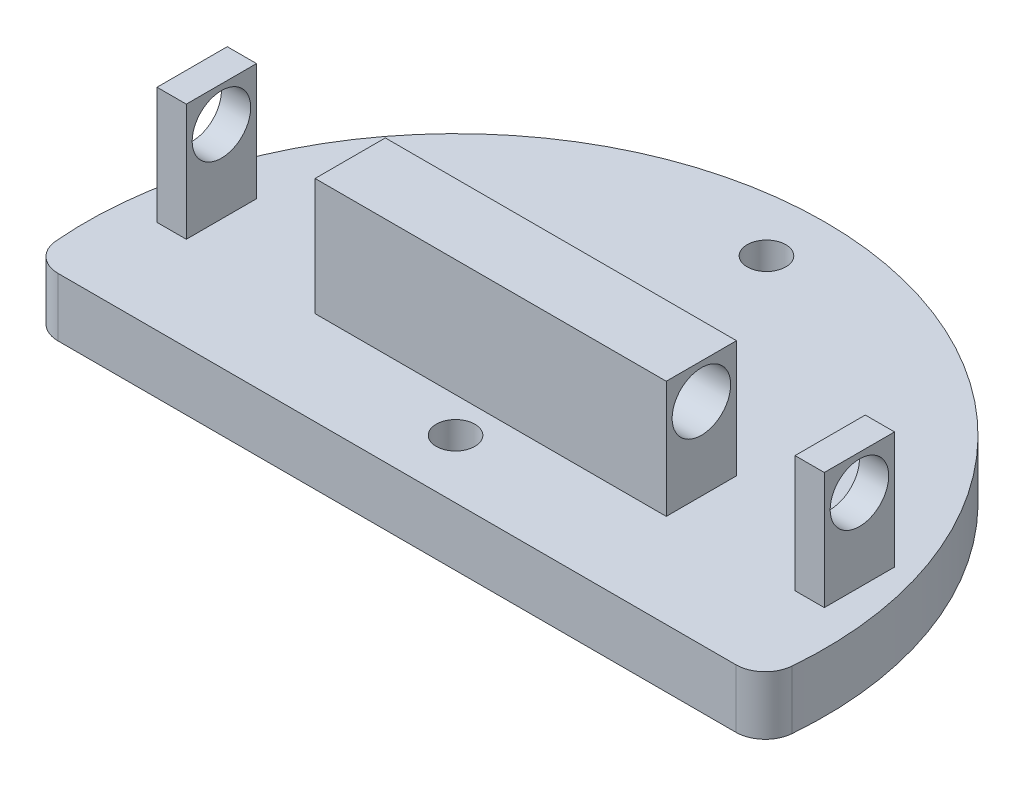
ISO-10303-21;
HEADER;
FILE_DESCRIPTION(('STEP AP214'),'2;1');
FILE_NAME('part.step','',(''),(''),'','','');
FILE_SCHEMA(('AUTOMOTIVE_DESIGN { 1 0 10303 214 1 1 1 1 }'));
ENDSEC;
DATA;
#1=APPLICATION_CONTEXT('core data for automotive mechanical design processes');
#2=APPLICATION_PROTOCOL_DEFINITION('international standard','automotive_design',2000,#1);
#3=PRODUCT_CONTEXT('',#1,'mechanical');
#4=PRODUCT('Part','Part','',(#3));
#5=PRODUCT_RELATED_PRODUCT_CATEGORY('part','',(#4));
#6=PRODUCT_DEFINITION_FORMATION('','',#4);
#7=PRODUCT_DEFINITION_CONTEXT('part definition',#1,'design');
#8=PRODUCT_DEFINITION('design','',#6,#7);
#9=PRODUCT_DEFINITION_SHAPE('','',#8);
#10=(LENGTH_UNIT() NAMED_UNIT(*) SI_UNIT(.MILLI.,.METRE.));
#11=(NAMED_UNIT(*) PLANE_ANGLE_UNIT() SI_UNIT($,.RADIAN.));
#12=(NAMED_UNIT(*) SI_UNIT($,.STERADIAN.) SOLID_ANGLE_UNIT());
#13=UNCERTAINTY_MEASURE_WITH_UNIT(LENGTH_MEASURE(1.E-05),#10,'distance_accuracy_value','');
#14=(GEOMETRIC_REPRESENTATION_CONTEXT(3) GLOBAL_UNCERTAINTY_ASSIGNED_CONTEXT((#13)) GLOBAL_UNIT_ASSIGNED_CONTEXT((#10,
#11,#12)) REPRESENTATION_CONTEXT('',''));
#15=CARTESIAN_POINT('',(0.,0.,0.));
#16=DIRECTION('',(0.,0.,1.));
#17=DIRECTION('',(1.,0.,0.));
#18=AXIS2_PLACEMENT_3D('',#15,#16,#17);
#19=CARTESIAN_POINT('',(0.,5.,0.));
#20=DIRECTION('',(0.,-1.,0.));
#21=DIRECTION('',(0.,0.,-1.));
#22=AXIS2_PLACEMENT_3D('',#19,#20,#21);
#23=PLANE('',#22);
#24=DIRECTION('',(0.,0.,1.));
#25=VECTOR('',#24,1.);
#26=CARTESIAN_POINT('',(26.,5.,-3.));
#27=LINE('',#26,#25);
#28=CARTESIAN_POINT('',(26.,5.,-9.));
#29=VERTEX_POINT('',#28);
#30=CARTESIAN_POINT('',(26.,5.,-3.));
#31=VERTEX_POINT('',#30);
#32=EDGE_CURVE('E191',#29,#31,#27,.T.);
#33=ORIENTED_EDGE('',*,*,#32,.F.);
#34=DIRECTION('',(-1.,0.,0.));
#35=VECTOR('',#34,1.);
#36=CARTESIAN_POINT('',(26.,5.,-9.));
#37=LINE('',#36,#35);
#38=CARTESIAN_POINT('',(28.5,5.,-9.));
#39=VERTEX_POINT('',#38);
#40=EDGE_CURVE('E204',#39,#29,#37,.T.);
#41=ORIENTED_EDGE('',*,*,#40,.F.);
#42=DIRECTION('',(0.,0.,-1.));
#43=VECTOR('',#42,1.);
#44=CARTESIAN_POINT('',(28.5,5.,-3.));
#45=LINE('',#44,#43);
#46=CARTESIAN_POINT('',(28.5,5.,-3.));
#47=VERTEX_POINT('',#46);
#48=EDGE_CURVE('E213',#47,#39,#45,.T.);
#49=ORIENTED_EDGE('',*,*,#48,.F.);
#50=DIRECTION('',(1.,0.,0.));
#51=VECTOR('',#50,1.);
#52=CARTESIAN_POINT('',(26.,5.,-3.));
#53=LINE('',#52,#51);
#54=EDGE_CURVE('E194',#31,#47,#53,.T.);
#55=ORIENTED_EDGE('',*,*,#54,.F.);
#56=EDGE_LOOP('',(#33,#41,#49,#55));
#57=FACE_BOUND('',#56,.T.);
#58=CARTESIAN_POINT('',(0.,5.,-26.56));
#59=DIRECTION('',(0.,1.,0.));
#60=DIRECTION('',(0.,0.,1.));
#61=AXIS2_PLACEMENT_3D('',#58,#59,#60);
#62=CIRCLE('',#61,1.65);
#63=CARTESIAN_POINT('',(0.,5.,-24.91));
#64=VERTEX_POINT('',#63);
#65=EDGE_CURVE('E263',#64,#64,#62,.T.);
#66=ORIENTED_EDGE('',*,*,#65,.F.);
#67=EDGE_LOOP('',(#66));
#68=FACE_BOUND('',#67,.T.);
#69=CARTESIAN_POINT('',(0.,5.,0.));
#70=DIRECTION('',(0.,1.,0.));
#71=DIRECTION('',(0.,0.,1.));
#72=AXIS2_PLACEMENT_3D('',#69,#70,#71);
#73=CIRCLE('',#72,1.65);
#74=CARTESIAN_POINT('',(0.,5.,1.65));
#75=VERTEX_POINT('',#74);
#76=EDGE_CURVE('E269',#75,#75,#73,.T.);
#77=ORIENTED_EDGE('',*,*,#76,.F.);
#78=EDGE_LOOP('',(#77));
#79=FACE_BOUND('',#78,.T.);
#80=DIRECTION('',(-1.,0.,0.));
#81=VECTOR('',#80,1.);
#82=CARTESIAN_POINT('',(0.,5.,5.));
#83=LINE('',#82,#81);
#84=CARTESIAN_POINT('',(28.9522641601654,5.,5.));
#85=VERTEX_POINT('',#84);
#86=CARTESIAN_POINT('',(-28.9522641601654,5.,5.));
#87=VERTEX_POINT('',#86);
#88=EDGE_CURVE('E275',#85,#87,#83,.T.);
#89=ORIENTED_EDGE('',*,*,#88,.F.);
#90=CARTESIAN_POINT('',(28.9522641601654,5.,2.5));
#91=DIRECTION('',(0.,-1.,0.));
#92=DIRECTION('',(0.,0.,-1.));
#93=AXIS2_PLACEMENT_3D('',#90,#91,#92);
#94=CIRCLE('',#93,2.5);
#95=CARTESIAN_POINT('',(31.4429957637585,5.,2.7150722642808));
#96=VERTEX_POINT('',#95);
#97=EDGE_CURVE('E12',#85,#96,#94,.F.);
#98=ORIENTED_EDGE('',*,*,#97,.T.);
#99=CARTESIAN_POINT('',(0.,5.,0.));
#100=DIRECTION('',(0.,-1.,0.));
#101=DIRECTION('',(0.,0.,-1.));
#102=AXIS2_PLACEMENT_3D('',#99,#100,#101);
#103=CIRCLE('',#102,31.56);
#104=CARTESIAN_POINT('',(-31.4429957637585,5.,2.7150722642808));
#105=VERTEX_POINT('',#104);
#106=EDGE_CURVE('E278',#105,#96,#103,.T.);
#107=ORIENTED_EDGE('',*,*,#106,.F.);
#108=CARTESIAN_POINT('',(-28.9522641601654,5.,2.5));
#109=DIRECTION('',(0.,-1.,0.));
#110=DIRECTION('',(0.,0.,-1.));
#111=AXIS2_PLACEMENT_3D('',#108,#109,#110);
#112=CIRCLE('',#111,2.5);
#113=EDGE_CURVE('E66',#105,#87,#112,.F.);
#114=ORIENTED_EDGE('',*,*,#113,.T.);
#115=EDGE_LOOP('',(#89,#98,#107,#114));
#116=FACE_BOUND('',#115,.T.);
#117=DIRECTION('',(0.,0.,1.));
#118=VECTOR('',#117,1.);
#119=CARTESIAN_POINT('',(-28.5,5.,-3.));
#120=LINE('',#119,#118);
#121=CARTESIAN_POINT('',(-28.5,5.,-9.));
#122=VERTEX_POINT('',#121);
#123=CARTESIAN_POINT('',(-28.5,5.,-3.));
#124=VERTEX_POINT('',#123);
#125=EDGE_CURVE('E229',#122,#124,#120,.T.);
#126=ORIENTED_EDGE('',*,*,#125,.F.);
#127=DIRECTION('',(-1.,0.,0.));
#128=VECTOR('',#127,1.);
#129=CARTESIAN_POINT('',(-28.5,5.,-9.));
#130=LINE('',#129,#128);
#131=CARTESIAN_POINT('',(-26.,5.,-9.));
#132=VERTEX_POINT('',#131);
#133=EDGE_CURVE('E234',#132,#122,#130,.T.);
#134=ORIENTED_EDGE('',*,*,#133,.F.);
#135=DIRECTION('',(0.,0.,-1.));
#136=VECTOR('',#135,1.);
#137=CARTESIAN_POINT('',(-26.,5.,-3.));
#138=LINE('',#137,#136);
#139=CARTESIAN_POINT('',(-26.,5.,-3.));
#140=VERTEX_POINT('',#139);
#141=EDGE_CURVE('E246',#140,#132,#138,.T.);
#142=ORIENTED_EDGE('',*,*,#141,.F.);
#143=DIRECTION('',(1.,0.,0.));
#144=VECTOR('',#143,1.);
#145=CARTESIAN_POINT('',(-28.5,5.,-3.));
#146=LINE('',#145,#144);
#147=EDGE_CURVE('E243',#124,#140,#146,.T.);
#148=ORIENTED_EDGE('',*,*,#147,.F.);
#149=EDGE_LOOP('',(#126,#134,#142,#148));
#150=FACE_BOUND('',#149,.T.);
#151=DIRECTION('',(0.,0.,1.));
#152=VECTOR('',#151,1.);
#153=CARTESIAN_POINT('',(-15.,5.,-3.));
#154=LINE('',#153,#152);
#155=CARTESIAN_POINT('',(-15.,5.,-9.));
#156=VERTEX_POINT('',#155);
#157=CARTESIAN_POINT('',(-15.,5.,-3.));
#158=VERTEX_POINT('',#157);
#159=EDGE_CURVE('E190',#156,#158,#154,.T.);
#160=ORIENTED_EDGE('',*,*,#159,.F.);
#161=DIRECTION('',(-1.,0.,0.));
#162=VECTOR('',#161,1.);
#163=CARTESIAN_POINT('',(-15.,5.,-9.));
#164=LINE('',#163,#162);
#165=CARTESIAN_POINT('',(15.,5.,-9.));
#166=VERTEX_POINT('',#165);
#167=EDGE_CURVE('E187',#166,#156,#164,.T.);
#168=ORIENTED_EDGE('',*,*,#167,.F.);
#169=DIRECTION('',(0.,0.,-1.));
#170=VECTOR('',#169,1.);
#171=CARTESIAN_POINT('',(15.,5.,-3.));
#172=LINE('',#171,#170);
#173=CARTESIAN_POINT('',(15.,5.,-3.));
#174=VERTEX_POINT('',#173);
#175=EDGE_CURVE('E78',#174,#166,#172,.T.);
#176=ORIENTED_EDGE('',*,*,#175,.F.);
#177=DIRECTION('',(1.,0.,0.));
#178=VECTOR('',#177,1.);
#179=CARTESIAN_POINT('',(-15.,5.,-3.));
#180=LINE('',#179,#178);
#181=EDGE_CURVE('E73',#158,#174,#180,.T.);
#182=ORIENTED_EDGE('',*,*,#181,.F.);
#183=EDGE_LOOP('',(#160,#168,#176,#182));
#184=FACE_BOUND('',#183,.T.);
#185=ADVANCED_FACE('F57',(#57,#68,#79,#116,#150,#184),#23,.F.);
#186=CARTESIAN_POINT('',(0.,0.,0.));
#187=DIRECTION('',(0.,-1.,0.));
#188=DIRECTION('',(0.,0.,-1.));
#189=AXIS2_PLACEMENT_3D('',#186,#187,#188);
#190=PLANE('',#189);
#191=CARTESIAN_POINT('',(0.,0.,0.));
#192=DIRECTION('',(0.,1.,0.));
#193=DIRECTION('',(0.,0.,1.));
#194=AXIS2_PLACEMENT_3D('',#191,#192,#193);
#195=CIRCLE('',#194,1.65);
#196=CARTESIAN_POINT('',(0.,0.,1.65));
#197=VERTEX_POINT('',#196);
#198=EDGE_CURVE('E266',#197,#197,#195,.T.);
#199=ORIENTED_EDGE('',*,*,#198,.T.);
#200=EDGE_LOOP('',(#199));
#201=FACE_BOUND('',#200,.T.);
#202=CARTESIAN_POINT('',(0.,0.,0.));
#203=DIRECTION('',(0.,-1.,0.));
#204=DIRECTION('',(0.,0.,-1.));
#205=AXIS2_PLACEMENT_3D('',#202,#203,#204);
#206=CIRCLE('',#205,31.56);
#207=CARTESIAN_POINT('',(-31.4429957637585,0.,2.7150722642808));
#208=VERTEX_POINT('',#207);
#209=CARTESIAN_POINT('',(31.4429957637585,0.,2.7150722642808));
#210=VERTEX_POINT('',#209);
#211=EDGE_CURVE('E272',#208,#210,#206,.T.);
#212=ORIENTED_EDGE('',*,*,#211,.T.);
#213=CARTESIAN_POINT('',(28.9522641601654,0.,2.5));
#214=DIRECTION('',(0.,-1.,0.));
#215=DIRECTION('',(0.,0.,-1.));
#216=AXIS2_PLACEMENT_3D('',#213,#214,#215);
#217=CIRCLE('',#216,2.5);
#218=CARTESIAN_POINT('',(28.9522641601654,0.,5.));
#219=VERTEX_POINT('',#218);
#220=EDGE_CURVE('E293',#210,#219,#217,.T.);
#221=ORIENTED_EDGE('',*,*,#220,.T.);
#222=DIRECTION('',(1.,0.,0.));
#223=VECTOR('',#222,1.);
#224=CARTESIAN_POINT('',(0.,0.,5.));
#225=LINE('',#224,#223);
#226=CARTESIAN_POINT('',(-28.9522641601654,0.,5.));
#227=VERTEX_POINT('',#226);
#228=EDGE_CURVE('E279',#227,#219,#225,.T.);
#229=ORIENTED_EDGE('',*,*,#228,.F.);
#230=CARTESIAN_POINT('',(-28.9522641601654,0.,2.5));
#231=DIRECTION('',(0.,-1.,0.));
#232=DIRECTION('',(0.,0.,-1.));
#233=AXIS2_PLACEMENT_3D('',#230,#231,#232);
#234=CIRCLE('',#233,2.5);
#235=EDGE_CURVE('E291',#227,#208,#234,.T.);
#236=ORIENTED_EDGE('',*,*,#235,.T.);
#237=EDGE_LOOP('',(#212,#221,#229,#236));
#238=FACE_BOUND('',#237,.T.);
#239=CARTESIAN_POINT('',(0.,0.,-26.56));
#240=DIRECTION('',(0.,1.,0.));
#241=DIRECTION('',(0.,0.,1.));
#242=AXIS2_PLACEMENT_3D('',#239,#240,#241);
#243=CIRCLE('',#242,1.65);
#244=CARTESIAN_POINT('',(0.,0.,-24.91));
#245=VERTEX_POINT('',#244);
#246=EDGE_CURVE('E262',#245,#245,#243,.T.);
#247=ORIENTED_EDGE('',*,*,#246,.T.);
#248=EDGE_LOOP('',(#247));
#249=FACE_BOUND('',#248,.T.);
#250=ADVANCED_FACE('F315',(#201,#238,#249),#190,.T.);
#251=CARTESIAN_POINT('',(0.,5.,5.));
#252=DIRECTION('',(0.,0.,-1.));
#253=DIRECTION('',(-1.,0.,0.));
#254=AXIS2_PLACEMENT_3D('',#251,#252,#253);
#255=PLANE('',#254);
#256=ORIENTED_EDGE('',*,*,#228,.T.);
#257=DIRECTION('',(0.,1.,0.));
#258=VECTOR('',#257,1.);
#259=CARTESIAN_POINT('',(28.9522641601654,5.,5.));
#260=LINE('',#259,#258);
#261=EDGE_CURVE('E298',#219,#85,#260,.T.);
#262=ORIENTED_EDGE('',*,*,#261,.T.);
#263=ORIENTED_EDGE('',*,*,#88,.T.);
#264=DIRECTION('',(0.,1.,0.));
#265=VECTOR('',#264,1.);
#266=CARTESIAN_POINT('',(-28.9522641601654,0.,5.));
#267=LINE('',#266,#265);
#268=EDGE_CURVE('E295',#87,#227,#267,.F.);
#269=ORIENTED_EDGE('',*,*,#268,.T.);
#270=EDGE_LOOP('',(#256,#262,#263,#269));
#271=FACE_BOUND('',#270,.T.);
#272=ADVANCED_FACE('F310',(#271),#255,.F.);
#273=CARTESIAN_POINT('',(0.,5.,0.));
#274=DIRECTION('',(0.,-1.,0.));
#275=DIRECTION('',(0.,0.,-1.));
#276=AXIS2_PLACEMENT_3D('',#273,#274,#275);
#277=CYLINDRICAL_SURFACE('',#276,31.56);
#278=ORIENTED_EDGE('',*,*,#106,.T.);
#279=DIRECTION('',(0.,-1.,0.));
#280=VECTOR('',#279,1.);
#281=CARTESIAN_POINT('',(31.4429957637585,5.,2.7150722642808));
#282=LINE('',#281,#280);
#283=EDGE_CURVE('E288',#96,#210,#282,.T.);
#284=ORIENTED_EDGE('',*,*,#283,.T.);
#285=ORIENTED_EDGE('',*,*,#211,.F.);
#286=DIRECTION('',(0.,-1.,0.));
#287=VECTOR('',#286,1.);
#288=CARTESIAN_POINT('',(-31.4429957637585,5.,2.7150722642808));
#289=LINE('',#288,#287);
#290=EDGE_CURVE('E282',#208,#105,#289,.F.);
#291=ORIENTED_EDGE('',*,*,#290,.T.);
#292=EDGE_LOOP('',(#278,#284,#285,#291));
#293=FACE_BOUND('',#292,.T.);
#294=ADVANCED_FACE('F318',(#293),#277,.T.);
#295=CARTESIAN_POINT('',(0.,5.,0.));
#296=DIRECTION('',(0.,-1.,0.));
#297=DIRECTION('',(0.,0.,-1.));
#298=AXIS2_PLACEMENT_3D('',#295,#296,#297);
#299=CYLINDRICAL_SURFACE('',#298,1.65);
#300=ORIENTED_EDGE('',*,*,#76,.T.);
#301=EDGE_LOOP('',(#300));
#302=FACE_BOUND('',#301,.T.);
#303=ORIENTED_EDGE('',*,*,#198,.F.);
#304=EDGE_LOOP('',(#303));
#305=FACE_BOUND('',#304,.T.);
#306=ADVANCED_FACE('F329',(#302,#305),#299,.F.);
#307=CARTESIAN_POINT('',(0.,5.,-26.56));
#308=DIRECTION('',(0.,-1.,0.));
#309=DIRECTION('',(0.,0.,-1.));
#310=AXIS2_PLACEMENT_3D('',#307,#308,#309);
#311=CYLINDRICAL_SURFACE('',#310,1.65);
#312=ORIENTED_EDGE('',*,*,#65,.T.);
#313=EDGE_LOOP('',(#312));
#314=FACE_BOUND('',#313,.T.);
#315=ORIENTED_EDGE('',*,*,#246,.F.);
#316=EDGE_LOOP('',(#315));
#317=FACE_BOUND('',#316,.T.);
#318=ADVANCED_FACE('F323',(#314,#317),#311,.F.);
#319=CARTESIAN_POINT('',(28.9522641601654,5.,2.5));
#320=DIRECTION('',(0.,-1.,0.));
#321=DIRECTION('',(0.,0.,-1.));
#322=AXIS2_PLACEMENT_3D('',#319,#320,#321);
#323=CYLINDRICAL_SURFACE('',#322,2.5);
#324=ORIENTED_EDGE('',*,*,#97,.F.);
#325=ORIENTED_EDGE('',*,*,#261,.F.);
#326=ORIENTED_EDGE('',*,*,#220,.F.);
#327=ORIENTED_EDGE('',*,*,#283,.F.);
#328=EDGE_LOOP('',(#324,#325,#326,#327));
#329=FACE_BOUND('',#328,.T.);
#330=ADVANCED_FACE('F321',(#329),#323,.T.);
#331=CARTESIAN_POINT('',(-28.9522641601654,5.,2.5));
#332=DIRECTION('',(0.,-1.,0.));
#333=DIRECTION('',(0.,0.,-1.));
#334=AXIS2_PLACEMENT_3D('',#331,#332,#333);
#335=CYLINDRICAL_SURFACE('',#334,2.5);
#336=ORIENTED_EDGE('',*,*,#113,.F.);
#337=ORIENTED_EDGE('',*,*,#290,.F.);
#338=ORIENTED_EDGE('',*,*,#235,.F.);
#339=ORIENTED_EDGE('',*,*,#268,.F.);
#340=EDGE_LOOP('',(#336,#337,#338,#339));
#341=FACE_BOUND('',#340,.T.);
#342=ADVANCED_FACE('F59',(#341),#335,.T.);
#343=CARTESIAN_POINT('',(-28.5,15.,-3.));
#344=DIRECTION('',(1.,0.,0.));
#345=DIRECTION('',(0.,0.,-1.));
#346=AXIS2_PLACEMENT_3D('',#343,#344,#345);
#347=PLANE('',#346);
#348=CARTESIAN_POINT('',(-28.5,12.,-6.));
#349=DIRECTION('',(-1.,0.,0.));
#350=DIRECTION('',(0.,0.,1.));
#351=AXIS2_PLACEMENT_3D('',#348,#349,#350);
#352=CIRCLE('',#351,2.5);
#353=CARTESIAN_POINT('',(-28.5,12.,-3.5));
#354=VERTEX_POINT('',#353);
#355=EDGE_CURVE('E572',#354,#354,#352,.T.);
#356=ORIENTED_EDGE('',*,*,#355,.F.);
#357=EDGE_LOOP('',(#356));
#358=FACE_BOUND('',#357,.T.);
#359=ORIENTED_EDGE('',*,*,#125,.T.);
#360=DIRECTION('',(0.,-1.,0.));
#361=VECTOR('',#360,1.);
#362=CARTESIAN_POINT('',(-28.5,15.,-3.));
#363=LINE('',#362,#361);
#364=CARTESIAN_POINT('',(-28.5,15.,-3.));
#365=VERTEX_POINT('',#364);
#366=EDGE_CURVE('E259',#365,#124,#363,.T.);
#367=ORIENTED_EDGE('',*,*,#366,.F.);
#368=DIRECTION('',(0.,0.,1.));
#369=VECTOR('',#368,1.);
#370=CARTESIAN_POINT('',(-28.5,15.,-3.));
#371=LINE('',#370,#369);
#372=CARTESIAN_POINT('',(-28.5,15.,-9.));
#373=VERTEX_POINT('',#372);
#374=EDGE_CURVE('E230',#373,#365,#371,.T.);
#375=ORIENTED_EDGE('',*,*,#374,.F.);
#376=DIRECTION('',(0.,-1.,0.));
#377=VECTOR('',#376,1.);
#378=CARTESIAN_POINT('',(-28.5,15.,-9.));
#379=LINE('',#378,#377);
#380=EDGE_CURVE('E240',#373,#122,#379,.T.);
#381=ORIENTED_EDGE('',*,*,#380,.T.);
#382=EDGE_LOOP('',(#359,#367,#375,#381));
#383=FACE_BOUND('',#382,.T.);
#384=ADVANCED_FACE('F328',(#358,#383),#347,.F.);
#385=CARTESIAN_POINT('',(-28.5,15.,-3.));
#386=DIRECTION('',(0.,0.,-1.));
#387=DIRECTION('',(-1.,0.,0.));
#388=AXIS2_PLACEMENT_3D('',#385,#386,#387);
#389=PLANE('',#388);
#390=ORIENTED_EDGE('',*,*,#147,.T.);
#391=DIRECTION('',(0.,-1.,0.));
#392=VECTOR('',#391,1.);
#393=CARTESIAN_POINT('',(-26.,15.,-3.));
#394=LINE('',#393,#392);
#395=CARTESIAN_POINT('',(-26.,15.,-3.));
#396=VERTEX_POINT('',#395);
#397=EDGE_CURVE('E256',#396,#140,#394,.T.);
#398=ORIENTED_EDGE('',*,*,#397,.F.);
#399=DIRECTION('',(1.,0.,0.));
#400=VECTOR('',#399,1.);
#401=CARTESIAN_POINT('',(-28.5,15.,-3.));
#402=LINE('',#401,#400);
#403=EDGE_CURVE('E233',#365,#396,#402,.T.);
#404=ORIENTED_EDGE('',*,*,#403,.F.);
#405=ORIENTED_EDGE('',*,*,#366,.T.);
#406=EDGE_LOOP('',(#390,#398,#404,#405));
#407=FACE_BOUND('',#406,.T.);
#408=ADVANCED_FACE('F400',(#407),#389,.F.);
#409=CARTESIAN_POINT('',(-26.,15.,-3.));
#410=DIRECTION('',(-1.,0.,0.));
#411=DIRECTION('',(0.,0.,1.));
#412=AXIS2_PLACEMENT_3D('',#409,#410,#411);
#413=PLANE('',#412);
#414=CARTESIAN_POINT('',(-26.,12.,-6.));
#415=DIRECTION('',(-1.,0.,0.));
#416=DIRECTION('',(0.,0.,1.));
#417=AXIS2_PLACEMENT_3D('',#414,#415,#416);
#418=CIRCLE('',#417,2.5);
#419=CARTESIAN_POINT('',(-26.,12.,-3.5));
#420=VERTEX_POINT('',#419);
#421=EDGE_CURVE('E575',#420,#420,#418,.T.);
#422=ORIENTED_EDGE('',*,*,#421,.T.);
#423=EDGE_LOOP('',(#422));
#424=FACE_BOUND('',#423,.T.);
#425=ORIENTED_EDGE('',*,*,#141,.T.);
#426=DIRECTION('',(0.,-1.,0.));
#427=VECTOR('',#426,1.);
#428=CARTESIAN_POINT('',(-26.,15.,-9.));
#429=LINE('',#428,#427);
#430=CARTESIAN_POINT('',(-26.,15.,-9.));
#431=VERTEX_POINT('',#430);
#432=EDGE_CURVE('E253',#431,#132,#429,.T.);
#433=ORIENTED_EDGE('',*,*,#432,.F.);
#434=DIRECTION('',(0.,0.,-1.));
#435=VECTOR('',#434,1.);
#436=CARTESIAN_POINT('',(-26.,15.,-3.));
#437=LINE('',#436,#435);
#438=EDGE_CURVE('E236',#396,#431,#437,.T.);
#439=ORIENTED_EDGE('',*,*,#438,.F.);
#440=ORIENTED_EDGE('',*,*,#397,.T.);
#441=EDGE_LOOP('',(#425,#433,#439,#440));
#442=FACE_BOUND('',#441,.T.);
#443=ADVANCED_FACE('F405',(#424,#442),#413,.F.);
#444=CARTESIAN_POINT('',(-28.5,15.,-9.));
#445=DIRECTION('',(0.,0.,1.));
#446=DIRECTION('',(1.,0.,0.));
#447=AXIS2_PLACEMENT_3D('',#444,#445,#446);
#448=PLANE('',#447);
#449=ORIENTED_EDGE('',*,*,#133,.T.);
#450=ORIENTED_EDGE('',*,*,#380,.F.);
#451=DIRECTION('',(-1.,0.,0.));
#452=VECTOR('',#451,1.);
#453=CARTESIAN_POINT('',(-28.5,15.,-9.));
#454=LINE('',#453,#452);
#455=EDGE_CURVE('E238',#431,#373,#454,.T.);
#456=ORIENTED_EDGE('',*,*,#455,.F.);
#457=ORIENTED_EDGE('',*,*,#432,.T.);
#458=EDGE_LOOP('',(#449,#450,#456,#457));
#459=FACE_BOUND('',#458,.T.);
#460=ADVANCED_FACE('F413',(#459),#448,.F.);
#461=CARTESIAN_POINT('',(0.,15.,0.));
#462=DIRECTION('',(0.,-1.,0.));
#463=DIRECTION('',(0.,0.,-1.));
#464=AXIS2_PLACEMENT_3D('',#461,#462,#463);
#465=PLANE('',#464);
#466=ORIENTED_EDGE('',*,*,#374,.T.);
#467=ORIENTED_EDGE('',*,*,#403,.T.);
#468=ORIENTED_EDGE('',*,*,#438,.T.);
#469=ORIENTED_EDGE('',*,*,#455,.T.);
#470=EDGE_LOOP('',(#466,#467,#468,#469));
#471=FACE_BOUND('',#470,.T.);
#472=ADVANCED_FACE('F418',(#471),#465,.F.);
#473=CARTESIAN_POINT('',(26.,15.,-3.));
#474=DIRECTION('',(1.,0.,0.));
#475=DIRECTION('',(0.,0.,-1.));
#476=AXIS2_PLACEMENT_3D('',#473,#474,#475);
#477=PLANE('',#476);
#478=CARTESIAN_POINT('',(26.,12.,-6.));
#479=DIRECTION('',(1.,0.,0.));
#480=DIRECTION('',(0.,0.,-1.));
#481=AXIS2_PLACEMENT_3D('',#478,#479,#480);
#482=CIRCLE('',#481,2.5);
#483=CARTESIAN_POINT('',(26.,12.,-8.5));
#484=VERTEX_POINT('',#483);
#485=EDGE_CURVE('E576',#484,#484,#482,.T.);
#486=ORIENTED_EDGE('',*,*,#485,.T.);
#487=EDGE_LOOP('',(#486));
#488=FACE_BOUND('',#487,.T.);
#489=ORIENTED_EDGE('',*,*,#32,.T.);
#490=DIRECTION('',(0.,-1.,0.));
#491=VECTOR('',#490,1.);
#492=CARTESIAN_POINT('',(26.,15.,-3.));
#493=LINE('',#492,#491);
#494=CARTESIAN_POINT('',(26.,15.,-3.));
#495=VERTEX_POINT('',#494);
#496=EDGE_CURVE('E226',#495,#31,#493,.T.);
#497=ORIENTED_EDGE('',*,*,#496,.F.);
#498=DIRECTION('',(0.,0.,1.));
#499=VECTOR('',#498,1.);
#500=CARTESIAN_POINT('',(26.,15.,-3.));
#501=LINE('',#500,#499);
#502=CARTESIAN_POINT('',(26.,15.,-9.));
#503=VERTEX_POINT('',#502);
#504=EDGE_CURVE('E200',#503,#495,#501,.T.);
#505=ORIENTED_EDGE('',*,*,#504,.F.);
#506=DIRECTION('',(0.,-1.,0.));
#507=VECTOR('',#506,1.);
#508=CARTESIAN_POINT('',(26.,15.,-9.));
#509=LINE('',#508,#507);
#510=EDGE_CURVE('E209',#503,#29,#509,.T.);
#511=ORIENTED_EDGE('',*,*,#510,.T.);
#512=EDGE_LOOP('',(#489,#497,#505,#511));
#513=FACE_BOUND('',#512,.T.);
#514=ADVANCED_FACE('F428',(#488,#513),#477,.F.);
#515=CARTESIAN_POINT('',(26.,15.,-3.));
#516=DIRECTION('',(0.,0.,-1.));
#517=DIRECTION('',(-1.,0.,0.));
#518=AXIS2_PLACEMENT_3D('',#515,#516,#517);
#519=PLANE('',#518);
#520=ORIENTED_EDGE('',*,*,#54,.T.);
#521=DIRECTION('',(0.,-1.,0.));
#522=VECTOR('',#521,1.);
#523=CARTESIAN_POINT('',(28.5,15.,-3.));
#524=LINE('',#523,#522);
#525=CARTESIAN_POINT('',(28.5,15.,-3.));
#526=VERTEX_POINT('',#525);
#527=EDGE_CURVE('E223',#526,#47,#524,.T.);
#528=ORIENTED_EDGE('',*,*,#527,.F.);
#529=DIRECTION('',(1.,0.,0.));
#530=VECTOR('',#529,1.);
#531=CARTESIAN_POINT('',(26.,15.,-3.));
#532=LINE('',#531,#530);
#533=EDGE_CURVE('E203',#495,#526,#532,.T.);
#534=ORIENTED_EDGE('',*,*,#533,.F.);
#535=ORIENTED_EDGE('',*,*,#496,.T.);
#536=EDGE_LOOP('',(#520,#528,#534,#535));
#537=FACE_BOUND('',#536,.T.);
#538=ADVANCED_FACE('F436',(#537),#519,.F.);
#539=CARTESIAN_POINT('',(28.5,15.,-3.));
#540=DIRECTION('',(-1.,0.,0.));
#541=DIRECTION('',(0.,0.,1.));
#542=AXIS2_PLACEMENT_3D('',#539,#540,#541);
#543=PLANE('',#542);
#544=CARTESIAN_POINT('',(28.5,12.,-6.));
#545=DIRECTION('',(-1.,0.,0.));
#546=DIRECTION('',(0.,0.,1.));
#547=AXIS2_PLACEMENT_3D('',#544,#545,#546);
#548=CIRCLE('',#547,2.5);
#549=CARTESIAN_POINT('',(28.5,12.,-3.5));
#550=VERTEX_POINT('',#549);
#551=EDGE_CURVE('E580',#550,#550,#548,.T.);
#552=ORIENTED_EDGE('',*,*,#551,.T.);
#553=EDGE_LOOP('',(#552));
#554=FACE_BOUND('',#553,.T.);
#555=ORIENTED_EDGE('',*,*,#48,.T.);
#556=DIRECTION('',(0.,-1.,0.));
#557=VECTOR('',#556,1.);
#558=CARTESIAN_POINT('',(28.5,15.,-9.));
#559=LINE('',#558,#557);
#560=CARTESIAN_POINT('',(28.5,15.,-9.));
#561=VERTEX_POINT('',#560);
#562=EDGE_CURVE('E220',#561,#39,#559,.T.);
#563=ORIENTED_EDGE('',*,*,#562,.F.);
#564=DIRECTION('',(0.,0.,-1.));
#565=VECTOR('',#564,1.);
#566=CARTESIAN_POINT('',(28.5,15.,-3.));
#567=LINE('',#566,#565);
#568=EDGE_CURVE('E206',#526,#561,#567,.T.);
#569=ORIENTED_EDGE('',*,*,#568,.F.);
#570=ORIENTED_EDGE('',*,*,#527,.T.);
#571=EDGE_LOOP('',(#555,#563,#569,#570));
#572=FACE_BOUND('',#571,.T.);
#573=ADVANCED_FACE('F441',(#554,#572),#543,.F.);
#574=CARTESIAN_POINT('',(26.,15.,-9.));
#575=DIRECTION('',(0.,0.,1.));
#576=DIRECTION('',(1.,0.,0.));
#577=AXIS2_PLACEMENT_3D('',#574,#575,#576);
#578=PLANE('',#577);
#579=ORIENTED_EDGE('',*,*,#40,.T.);
#580=ORIENTED_EDGE('',*,*,#510,.F.);
#581=DIRECTION('',(-1.,0.,0.));
#582=VECTOR('',#581,1.);
#583=CARTESIAN_POINT('',(26.,15.,-9.));
#584=LINE('',#583,#582);
#585=EDGE_CURVE('E208',#561,#503,#584,.T.);
#586=ORIENTED_EDGE('',*,*,#585,.F.);
#587=ORIENTED_EDGE('',*,*,#562,.T.);
#588=EDGE_LOOP('',(#579,#580,#586,#587));
#589=FACE_BOUND('',#588,.T.);
#590=ADVANCED_FACE('F449',(#589),#578,.F.);
#591=CARTESIAN_POINT('',(0.,15.,0.));
#592=DIRECTION('',(0.,-1.,0.));
#593=DIRECTION('',(0.,0.,-1.));
#594=AXIS2_PLACEMENT_3D('',#591,#592,#593);
#595=PLANE('',#594);
#596=ORIENTED_EDGE('',*,*,#504,.T.);
#597=ORIENTED_EDGE('',*,*,#533,.T.);
#598=ORIENTED_EDGE('',*,*,#568,.T.);
#599=ORIENTED_EDGE('',*,*,#585,.T.);
#600=EDGE_LOOP('',(#596,#597,#598,#599));
#601=FACE_BOUND('',#600,.T.);
#602=ADVANCED_FACE('F454',(#601),#595,.F.);
#603=CARTESIAN_POINT('',(-15.,15.,-3.));
#604=DIRECTION('',(1.,0.,0.));
#605=DIRECTION('',(0.,0.,-1.));
#606=AXIS2_PLACEMENT_3D('',#603,#604,#605);
#607=PLANE('',#606);
#608=CARTESIAN_POINT('',(-15.,12.,-6.));
#609=DIRECTION('',(1.,0.,0.));
#610=DIRECTION('',(0.,0.,-1.));
#611=AXIS2_PLACEMENT_3D('',#608,#609,#610);
#612=CIRCLE('',#611,2.5);
#613=CARTESIAN_POINT('',(-15.,12.,-8.5));
#614=VERTEX_POINT('',#613);
#615=EDGE_CURVE('E596',#614,#614,#612,.T.);
#616=ORIENTED_EDGE('',*,*,#615,.T.);
#617=EDGE_LOOP('',(#616));
#618=FACE_BOUND('',#617,.T.);
#619=ORIENTED_EDGE('',*,*,#159,.T.);
#620=DIRECTION('',(0.,-1.,0.));
#621=VECTOR('',#620,1.);
#622=CARTESIAN_POINT('',(-15.,15.,-3.));
#623=LINE('',#622,#621);
#624=CARTESIAN_POINT('',(-15.,15.,-3.));
#625=VERTEX_POINT('',#624);
#626=EDGE_CURVE('E171',#625,#158,#623,.T.);
#627=ORIENTED_EDGE('',*,*,#626,.F.);
#628=DIRECTION('',(0.,0.,1.));
#629=VECTOR('',#628,1.);
#630=CARTESIAN_POINT('',(-15.,15.,-3.));
#631=LINE('',#630,#629);
#632=CARTESIAN_POINT('',(-15.,15.,-9.));
#633=VERTEX_POINT('',#632);
#634=EDGE_CURVE('E178',#633,#625,#631,.T.);
#635=ORIENTED_EDGE('',*,*,#634,.F.);
#636=DIRECTION('',(0.,-1.,0.));
#637=VECTOR('',#636,1.);
#638=CARTESIAN_POINT('',(-15.,15.,-9.));
#639=LINE('',#638,#637);
#640=EDGE_CURVE('E585',#633,#156,#639,.T.);
#641=ORIENTED_EDGE('',*,*,#640,.T.);
#642=EDGE_LOOP('',(#619,#627,#635,#641));
#643=FACE_BOUND('',#642,.T.);
#644=ADVANCED_FACE('F189',(#618,#643),#607,.F.);
#645=CARTESIAN_POINT('',(-15.,15.,-3.));
#646=DIRECTION('',(0.,0.,-1.));
#647=DIRECTION('',(-1.,0.,0.));
#648=AXIS2_PLACEMENT_3D('',#645,#646,#647);
#649=PLANE('',#648);
#650=ORIENTED_EDGE('',*,*,#181,.T.);
#651=DIRECTION('',(0.,-1.,0.));
#652=VECTOR('',#651,1.);
#653=CARTESIAN_POINT('',(15.,15.,-3.));
#654=LINE('',#653,#652);
#655=CARTESIAN_POINT('',(15.,15.,-3.));
#656=VERTEX_POINT('',#655);
#657=EDGE_CURVE('E174',#656,#174,#654,.T.);
#658=ORIENTED_EDGE('',*,*,#657,.F.);
#659=DIRECTION('',(1.,0.,0.));
#660=VECTOR('',#659,1.);
#661=CARTESIAN_POINT('',(-15.,15.,-3.));
#662=LINE('',#661,#660);
#663=EDGE_CURVE('E167',#625,#656,#662,.T.);
#664=ORIENTED_EDGE('',*,*,#663,.F.);
#665=ORIENTED_EDGE('',*,*,#626,.T.);
#666=EDGE_LOOP('',(#650,#658,#664,#665));
#667=FACE_BOUND('',#666,.T.);
#668=ADVANCED_FACE('F169',(#667),#649,.F.);
#669=CARTESIAN_POINT('',(15.,15.,-3.));
#670=DIRECTION('',(-1.,0.,0.));
#671=DIRECTION('',(0.,0.,1.));
#672=AXIS2_PLACEMENT_3D('',#669,#670,#671);
#673=PLANE('',#672);
#674=CARTESIAN_POINT('',(15.,12.,-6.));
#675=DIRECTION('',(-1.,0.,0.));
#676=DIRECTION('',(0.,0.,1.));
#677=AXIS2_PLACEMENT_3D('',#674,#675,#676);
#678=CIRCLE('',#677,2.5);
#679=CARTESIAN_POINT('',(15.,12.,-3.5));
#680=VERTEX_POINT('',#679);
#681=EDGE_CURVE('E61',#680,#680,#678,.T.);
#682=ORIENTED_EDGE('',*,*,#681,.T.);
#683=EDGE_LOOP('',(#682));
#684=FACE_BOUND('',#683,.T.);
#685=ORIENTED_EDGE('',*,*,#175,.T.);
#686=DIRECTION('',(0.,-1.,0.));
#687=VECTOR('',#686,1.);
#688=CARTESIAN_POINT('',(15.,15.,-9.));
#689=LINE('',#688,#687);
#690=CARTESIAN_POINT('',(15.,15.,-9.));
#691=VERTEX_POINT('',#690);
#692=EDGE_CURVE('E196',#691,#166,#689,.T.);
#693=ORIENTED_EDGE('',*,*,#692,.F.);
#694=DIRECTION('',(0.,0.,-1.));
#695=VECTOR('',#694,1.);
#696=CARTESIAN_POINT('',(15.,15.,-3.));
#697=LINE('',#696,#695);
#698=EDGE_CURVE('E177',#656,#691,#697,.T.);
#699=ORIENTED_EDGE('',*,*,#698,.F.);
#700=ORIENTED_EDGE('',*,*,#657,.T.);
#701=EDGE_LOOP('',(#685,#693,#699,#700));
#702=FACE_BOUND('',#701,.T.);
#703=ADVANCED_FACE('F475',(#684,#702),#673,.F.);
#704=CARTESIAN_POINT('',(-15.,15.,-9.));
#705=DIRECTION('',(0.,0.,1.));
#706=DIRECTION('',(1.,0.,0.));
#707=AXIS2_PLACEMENT_3D('',#704,#705,#706);
#708=PLANE('',#707);
#709=ORIENTED_EDGE('',*,*,#167,.T.);
#710=ORIENTED_EDGE('',*,*,#640,.F.);
#711=DIRECTION('',(-1.,0.,0.));
#712=VECTOR('',#711,1.);
#713=CARTESIAN_POINT('',(-15.,15.,-9.));
#714=LINE('',#713,#712);
#715=EDGE_CURVE('E183',#691,#633,#714,.T.);
#716=ORIENTED_EDGE('',*,*,#715,.F.);
#717=ORIENTED_EDGE('',*,*,#692,.T.);
#718=EDGE_LOOP('',(#709,#710,#716,#717));
#719=FACE_BOUND('',#718,.T.);
#720=ADVANCED_FACE('F482',(#719),#708,.F.);
#721=CARTESIAN_POINT('',(0.,15.,0.));
#722=DIRECTION('',(0.,-1.,0.));
#723=DIRECTION('',(0.,0.,-1.));
#724=AXIS2_PLACEMENT_3D('',#721,#722,#723);
#725=PLANE('',#724);
#726=ORIENTED_EDGE('',*,*,#634,.T.);
#727=ORIENTED_EDGE('',*,*,#663,.T.);
#728=ORIENTED_EDGE('',*,*,#698,.T.);
#729=ORIENTED_EDGE('',*,*,#715,.T.);
#730=EDGE_LOOP('',(#726,#727,#728,#729));
#731=FACE_BOUND('',#730,.T.);
#732=ADVANCED_FACE('F181',(#731),#725,.F.);
#733=CARTESIAN_POINT('',(31.56,12.,-6.));
#734=DIRECTION('',(-1.,0.,0.));
#735=DIRECTION('',(0.,0.,1.));
#736=AXIS2_PLACEMENT_3D('',#733,#734,#735);
#737=CYLINDRICAL_SURFACE('',#736,2.5);
#738=ORIENTED_EDGE('',*,*,#681,.F.);
#739=EDGE_LOOP('',(#738));
#740=FACE_BOUND('',#739,.T.);
#741=ORIENTED_EDGE('',*,*,#615,.F.);
#742=EDGE_LOOP('',(#741));
#743=FACE_BOUND('',#742,.T.);
#744=ADVANCED_FACE('F496',(#740,#743),#737,.F.);
#745=ORIENTED_EDGE('',*,*,#551,.F.);
#746=EDGE_LOOP('',(#745));
#747=FACE_BOUND('',#746,.T.);
#748=ORIENTED_EDGE('',*,*,#485,.F.);
#749=EDGE_LOOP('',(#748));
#750=FACE_BOUND('',#749,.T.);
#751=ADVANCED_FACE('F547',(#747,#750),#737,.F.);
#752=ORIENTED_EDGE('',*,*,#355,.T.);
#753=EDGE_LOOP('',(#752));
#754=FACE_BOUND('',#753,.T.);
#755=ORIENTED_EDGE('',*,*,#421,.F.);
#756=EDGE_LOOP('',(#755));
#757=FACE_BOUND('',#756,.T.);
#758=ADVANCED_FACE('F550',(#754,#757),#737,.F.);
#759=CLOSED_SHELL('',(#185,#250,#272,#294,#306,#318,#330,#342,#384,#408,#443,#460,#472,#514,
#538,#573,#590,#602,#644,#668,#703,#720,#732,#744,#751,#758));
#760=MANIFOLD_SOLID_BREP('B2',#759);
#761=ADVANCED_BREP_SHAPE_REPRESENTATION('',(#18,#760),#14);
#762=SHAPE_DEFINITION_REPRESENTATION(#9,#761);
ENDSEC;
END-ISO-10303-21;
